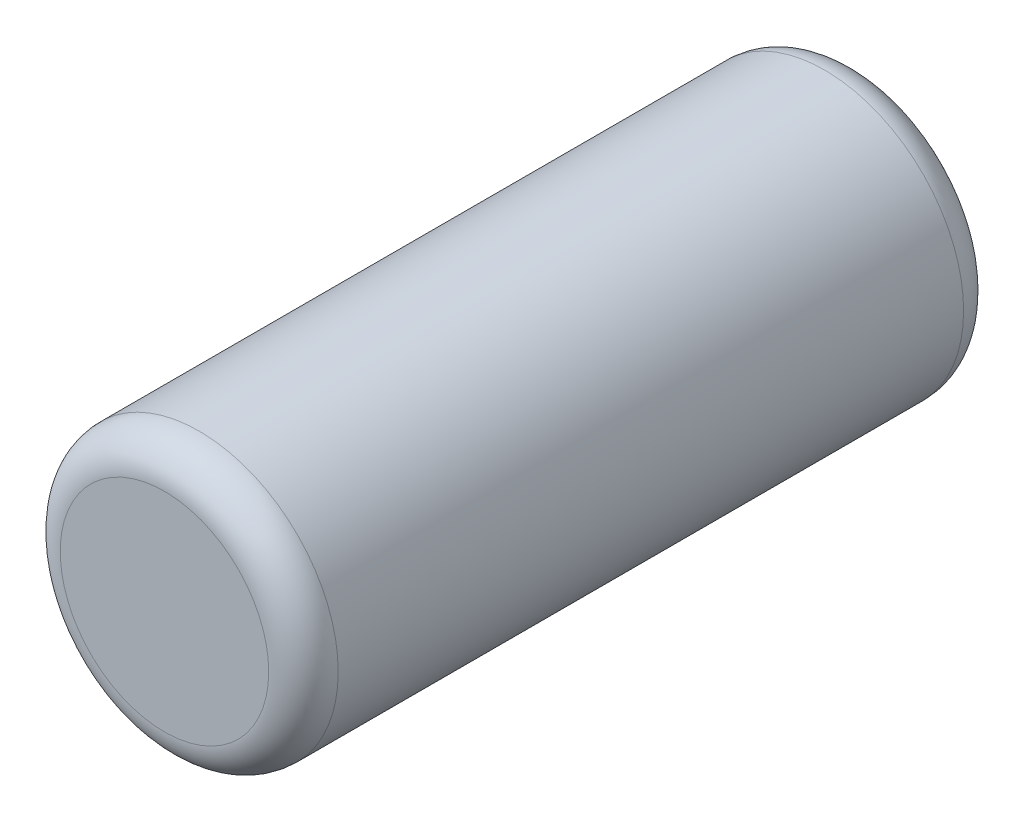
ISO-10303-21;
HEADER;
FILE_DESCRIPTION(('STEP AP214'),'2;1');
FILE_NAME('part.step','',(''),(''),'','','');
FILE_SCHEMA(('AUTOMOTIVE_DESIGN { 1 0 10303 214 1 1 1 1 }'));
ENDSEC;
DATA;
#1=APPLICATION_CONTEXT('core data for automotive mechanical design processes');
#2=APPLICATION_PROTOCOL_DEFINITION('international standard','automotive_design',2000,#1);
#3=PRODUCT_CONTEXT('',#1,'mechanical');
#4=PRODUCT('Part','Part','',(#3));
#5=PRODUCT_RELATED_PRODUCT_CATEGORY('part','',(#4));
#6=PRODUCT_DEFINITION_FORMATION('','',#4);
#7=PRODUCT_DEFINITION_CONTEXT('part definition',#1,'design');
#8=PRODUCT_DEFINITION('design','',#6,#7);
#9=PRODUCT_DEFINITION_SHAPE('','',#8);
#10=(LENGTH_UNIT() NAMED_UNIT(*) SI_UNIT(.MILLI.,.METRE.));
#11=(NAMED_UNIT(*) PLANE_ANGLE_UNIT() SI_UNIT($,.RADIAN.));
#12=(NAMED_UNIT(*) SI_UNIT($,.STERADIAN.) SOLID_ANGLE_UNIT());
#13=UNCERTAINTY_MEASURE_WITH_UNIT(LENGTH_MEASURE(1.E-05),#10,'distance_accuracy_value','');
#14=(GEOMETRIC_REPRESENTATION_CONTEXT(3) GLOBAL_UNCERTAINTY_ASSIGNED_CONTEXT((#13)) GLOBAL_UNIT_ASSIGNED_CONTEXT((#10,
#11,#12)) REPRESENTATION_CONTEXT('',''));
#15=CARTESIAN_POINT('',(0.,0.,0.));
#16=DIRECTION('',(0.,0.,1.));
#17=DIRECTION('',(1.,0.,0.));
#18=AXIS2_PLACEMENT_3D('',#15,#16,#17);
#19=CARTESIAN_POINT('',(0.,0.,20.));
#20=DIRECTION('',(0.,0.,-1.));
#21=DIRECTION('',(-1.,0.,0.));
#22=AXIS2_PLACEMENT_3D('',#19,#20,#21);
#23=CYLINDRICAL_SURFACE('',#22,4.);
#24=CARTESIAN_POINT('',(0.,0.,1.));
#25=DIRECTION('',(0.,0.,1.));
#26=DIRECTION('',(1.,0.,0.));
#27=AXIS2_PLACEMENT_3D('',#24,#25,#26);
#28=CIRCLE('',#27,4.);
#29=CARTESIAN_POINT('',(4.,0.,1.));
#30=VERTEX_POINT('',#29);
#31=EDGE_CURVE('E50',#30,#30,#28,.T.);
#32=ORIENTED_EDGE('',*,*,#31,.T.);
#33=EDGE_LOOP('',(#32));
#34=FACE_BOUND('',#33,.T.);
#35=CARTESIAN_POINT('',(0.,0.,19.));
#36=DIRECTION('',(0.,0.,1.));
#37=DIRECTION('',(1.,0.,0.));
#38=AXIS2_PLACEMENT_3D('',#35,#36,#37);
#39=CIRCLE('',#38,4.);
#40=CARTESIAN_POINT('',(4.,0.,19.));
#41=VERTEX_POINT('',#40);
#42=EDGE_CURVE('E55',#41,#41,#39,.F.);
#43=ORIENTED_EDGE('',*,*,#42,.T.);
#44=EDGE_LOOP('',(#43));
#45=FACE_BOUND('',#44,.T.);
#46=ADVANCED_FACE('F37',(#34,#45),#23,.T.);
#47=CARTESIAN_POINT('',(0.,0.,20.));
#48=DIRECTION('',(0.,0.,1.));
#49=DIRECTION('',(1.,0.,0.));
#50=AXIS2_PLACEMENT_3D('',#47,#48,#49);
#51=PLANE('',#50);
#52=CARTESIAN_POINT('',(0.,0.,20.));
#53=DIRECTION('',(0.,0.,1.));
#54=DIRECTION('',(1.,0.,0.));
#55=AXIS2_PLACEMENT_3D('',#52,#53,#54);
#56=CIRCLE('',#55,3.);
#57=CARTESIAN_POINT('',(3.,0.,20.));
#58=VERTEX_POINT('',#57);
#59=EDGE_CURVE('E10',#58,#58,#56,.T.);
#60=ORIENTED_EDGE('',*,*,#59,.T.);
#61=EDGE_LOOP('',(#60));
#62=FACE_BOUND('',#61,.T.);
#63=ADVANCED_FACE('F72',(#62),#51,.T.);
#64=CARTESIAN_POINT('',(0.,0.,0.));
#65=DIRECTION('',(0.,0.,1.));
#66=DIRECTION('',(1.,0.,0.));
#67=AXIS2_PLACEMENT_3D('',#64,#65,#66);
#68=PLANE('',#67);
#69=CARTESIAN_POINT('',(0.,0.,0.));
#70=DIRECTION('',(0.,0.,1.));
#71=DIRECTION('',(1.,0.,0.));
#72=AXIS2_PLACEMENT_3D('',#69,#70,#71);
#73=CIRCLE('',#72,3.);
#74=CARTESIAN_POINT('',(3.,0.,0.));
#75=VERTEX_POINT('',#74);
#76=EDGE_CURVE('E45',#75,#75,#73,.F.);
#77=ORIENTED_EDGE('',*,*,#76,.T.);
#78=EDGE_LOOP('',(#77));
#79=FACE_BOUND('',#78,.T.);
#80=ADVANCED_FACE('F69',(#79),#68,.F.);
#81=CARTESIAN_POINT('',(0.,0.,1.));
#82=DIRECTION('',(0.,0.,1.));
#83=DIRECTION('',(1.,0.,0.));
#84=AXIS2_PLACEMENT_3D('',#81,#82,#83);
#85=TOROIDAL_SURFACE('',#84,3.,1.);
#86=ORIENTED_EDGE('',*,*,#76,.F.);
#87=EDGE_LOOP('',(#86));
#88=FACE_BOUND('',#87,.T.);
#89=ORIENTED_EDGE('',*,*,#31,.F.);
#90=EDGE_LOOP('',(#89));
#91=FACE_BOUND('',#90,.T.);
#92=ADVANCED_FACE('F65',(#88,#91),#85,.T.);
#93=CARTESIAN_POINT('',(0.,0.,19.));
#94=DIRECTION('',(0.,0.,1.));
#95=DIRECTION('',(1.,0.,0.));
#96=AXIS2_PLACEMENT_3D('',#93,#94,#95);
#97=TOROIDAL_SURFACE('',#96,3.,1.);
#98=ORIENTED_EDGE('',*,*,#42,.F.);
#99=EDGE_LOOP('',(#98));
#100=FACE_BOUND('',#99,.T.);
#101=ORIENTED_EDGE('',*,*,#59,.F.);
#102=EDGE_LOOP('',(#101));
#103=FACE_BOUND('',#102,.T.);
#104=ADVANCED_FACE('F39',(#100,#103),#97,.T.);
#105=CLOSED_SHELL('',(#46,#63,#80,#92,#104));
#106=MANIFOLD_SOLID_BREP('B2',#105);
#107=ADVANCED_BREP_SHAPE_REPRESENTATION('',(#18,#106),#14);
#108=SHAPE_DEFINITION_REPRESENTATION(#9,#107);
ENDSEC;
END-ISO-10303-21;
